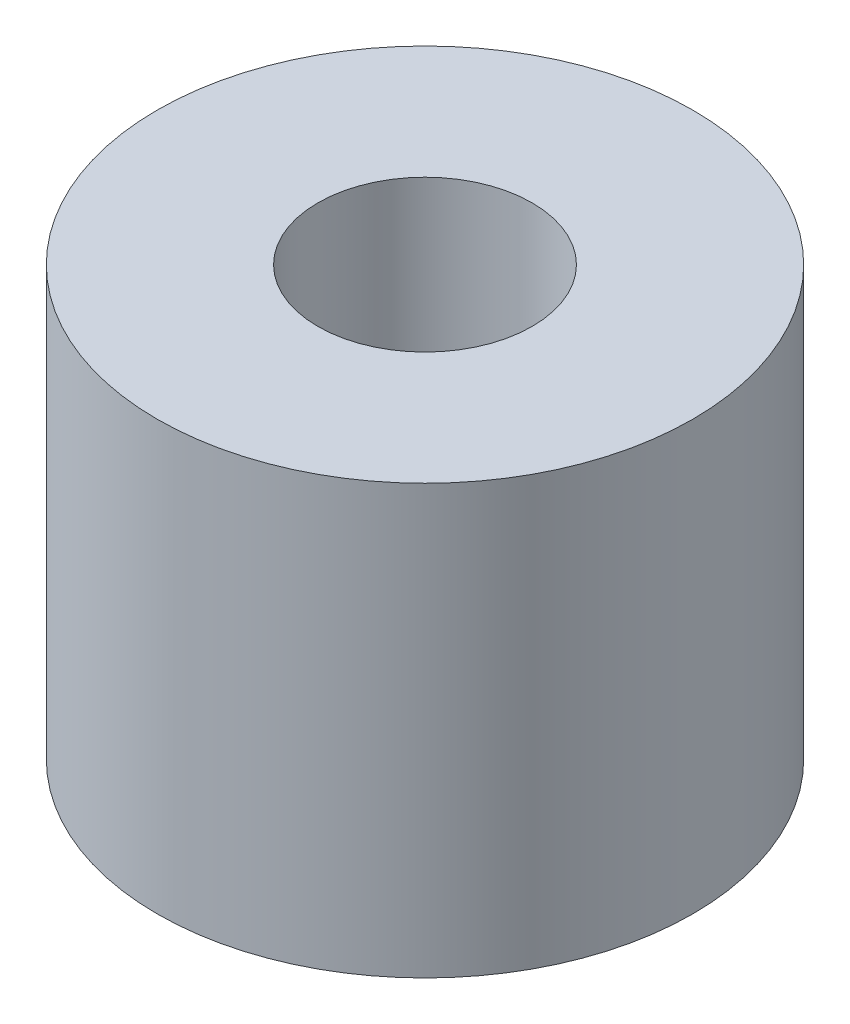
ISO-10303-21;
HEADER;
FILE_DESCRIPTION(('STEP AP214'),'2;1');
FILE_NAME('part.step','',(''),(''),'','','');
FILE_SCHEMA(('AUTOMOTIVE_DESIGN { 1 0 10303 214 1 1 1 1 }'));
ENDSEC;
DATA;
#1=APPLICATION_CONTEXT('core data for automotive mechanical design processes');
#2=APPLICATION_PROTOCOL_DEFINITION('international standard','automotive_design',2000,#1);
#3=PRODUCT_CONTEXT('',#1,'mechanical');
#4=PRODUCT('Part','Part','',(#3));
#5=PRODUCT_RELATED_PRODUCT_CATEGORY('part','',(#4));
#6=PRODUCT_DEFINITION_FORMATION('','',#4);
#7=PRODUCT_DEFINITION_CONTEXT('part definition',#1,'design');
#8=PRODUCT_DEFINITION('design','',#6,#7);
#9=PRODUCT_DEFINITION_SHAPE('','',#8);
#10=(LENGTH_UNIT() NAMED_UNIT(*) SI_UNIT(.MILLI.,.METRE.));
#11=(NAMED_UNIT(*) PLANE_ANGLE_UNIT() SI_UNIT($,.RADIAN.));
#12=(NAMED_UNIT(*) SI_UNIT($,.STERADIAN.) SOLID_ANGLE_UNIT());
#13=UNCERTAINTY_MEASURE_WITH_UNIT(LENGTH_MEASURE(1.E-05),#10,'distance_accuracy_value','');
#14=(GEOMETRIC_REPRESENTATION_CONTEXT(3) GLOBAL_UNCERTAINTY_ASSIGNED_CONTEXT((#13)) GLOBAL_UNIT_ASSIGNED_CONTEXT((#10,
#11,#12)) REPRESENTATION_CONTEXT('',''));
#15=CARTESIAN_POINT('',(0.,0.,0.));
#16=DIRECTION('',(0.,0.,1.));
#17=DIRECTION('',(1.,0.,0.));
#18=AXIS2_PLACEMENT_3D('',#15,#16,#17);
#19=CARTESIAN_POINT('',(0.,16.,0.));
#20=DIRECTION('',(0.,1.,0.));
#21=DIRECTION('',(0.,0.,1.));
#22=AXIS2_PLACEMENT_3D('',#19,#20,#21);
#23=PLANE('',#22);
#24=CARTESIAN_POINT('',(0.,16.,0.));
#25=DIRECTION('',(0.,1.,0.));
#26=DIRECTION('',(0.,0.,1.));
#27=AXIS2_PLACEMENT_3D('',#24,#25,#26);
#28=CIRCLE('',#27,10.);
#29=CARTESIAN_POINT('',(0.,16.,10.));
#30=VERTEX_POINT('',#29);
#31=EDGE_CURVE('E10',#30,#30,#28,.T.);
#32=ORIENTED_EDGE('',*,*,#31,.T.);
#33=EDGE_LOOP('',(#32));
#34=FACE_BOUND('',#33,.T.);
#35=CARTESIAN_POINT('',(0.,16.,0.));
#36=DIRECTION('',(0.,1.,0.));
#37=DIRECTION('',(0.,0.,1.));
#38=AXIS2_PLACEMENT_3D('',#35,#36,#37);
#39=CIRCLE('',#38,4.);
#40=CARTESIAN_POINT('',(0.,16.,4.));
#41=VERTEX_POINT('',#40);
#42=EDGE_CURVE('E57',#41,#41,#39,.T.);
#43=ORIENTED_EDGE('',*,*,#42,.F.);
#44=EDGE_LOOP('',(#43));
#45=FACE_BOUND('',#44,.T.);
#46=ADVANCED_FACE('F43',(#34,#45),#23,.T.);
#47=CARTESIAN_POINT('',(0.,0.,0.));
#48=DIRECTION('',(0.,1.,0.));
#49=DIRECTION('',(0.,0.,1.));
#50=AXIS2_PLACEMENT_3D('',#47,#48,#49);
#51=PLANE('',#50);
#52=CARTESIAN_POINT('',(0.,0.,0.));
#53=DIRECTION('',(0.,1.,0.));
#54=DIRECTION('',(0.,0.,1.));
#55=AXIS2_PLACEMENT_3D('',#52,#53,#54);
#56=CIRCLE('',#55,10.);
#57=CARTESIAN_POINT('',(0.,0.,10.));
#58=VERTEX_POINT('',#57);
#59=EDGE_CURVE('E50',#58,#58,#56,.T.);
#60=ORIENTED_EDGE('',*,*,#59,.F.);
#61=EDGE_LOOP('',(#60));
#62=FACE_BOUND('',#61,.T.);
#63=CARTESIAN_POINT('',(0.,0.,0.));
#64=DIRECTION('',(0.,1.,0.));
#65=DIRECTION('',(0.,0.,1.));
#66=AXIS2_PLACEMENT_3D('',#63,#64,#65);
#67=CIRCLE('',#66,4.);
#68=CARTESIAN_POINT('',(0.,0.,4.));
#69=VERTEX_POINT('',#68);
#70=EDGE_CURVE('E59',#69,#69,#67,.T.);
#71=ORIENTED_EDGE('',*,*,#70,.T.);
#72=EDGE_LOOP('',(#71));
#73=FACE_BOUND('',#72,.T.);
#74=ADVANCED_FACE('F69',(#62,#73),#51,.F.);
#75=CARTESIAN_POINT('',(0.,16.,0.));
#76=DIRECTION('',(0.,-1.,0.));
#77=DIRECTION('',(0.,0.,-1.));
#78=AXIS2_PLACEMENT_3D('',#75,#76,#77);
#79=CYLINDRICAL_SURFACE('',#78,10.);
#80=ORIENTED_EDGE('',*,*,#31,.F.);
#81=EDGE_LOOP('',(#80));
#82=FACE_BOUND('',#81,.T.);
#83=ORIENTED_EDGE('',*,*,#59,.T.);
#84=EDGE_LOOP('',(#83));
#85=FACE_BOUND('',#84,.T.);
#86=ADVANCED_FACE('F44',(#82,#85),#79,.T.);
#87=CARTESIAN_POINT('',(0.,16.,0.));
#88=DIRECTION('',(0.,-1.,0.));
#89=DIRECTION('',(0.,0.,-1.));
#90=AXIS2_PLACEMENT_3D('',#87,#88,#89);
#91=CYLINDRICAL_SURFACE('',#90,4.);
#92=ORIENTED_EDGE('',*,*,#42,.T.);
#93=EDGE_LOOP('',(#92));
#94=FACE_BOUND('',#93,.T.);
#95=ORIENTED_EDGE('',*,*,#70,.F.);
#96=EDGE_LOOP('',(#95));
#97=FACE_BOUND('',#96,.T.);
#98=ADVANCED_FACE('F66',(#94,#97),#91,.F.);
#99=CLOSED_SHELL('',(#46,#74,#86,#98));
#100=MANIFOLD_SOLID_BREP('B2',#99);
#101=ADVANCED_BREP_SHAPE_REPRESENTATION('',(#18,#100),#14);
#102=SHAPE_DEFINITION_REPRESENTATION(#9,#101);
ENDSEC;
END-ISO-10303-21;
